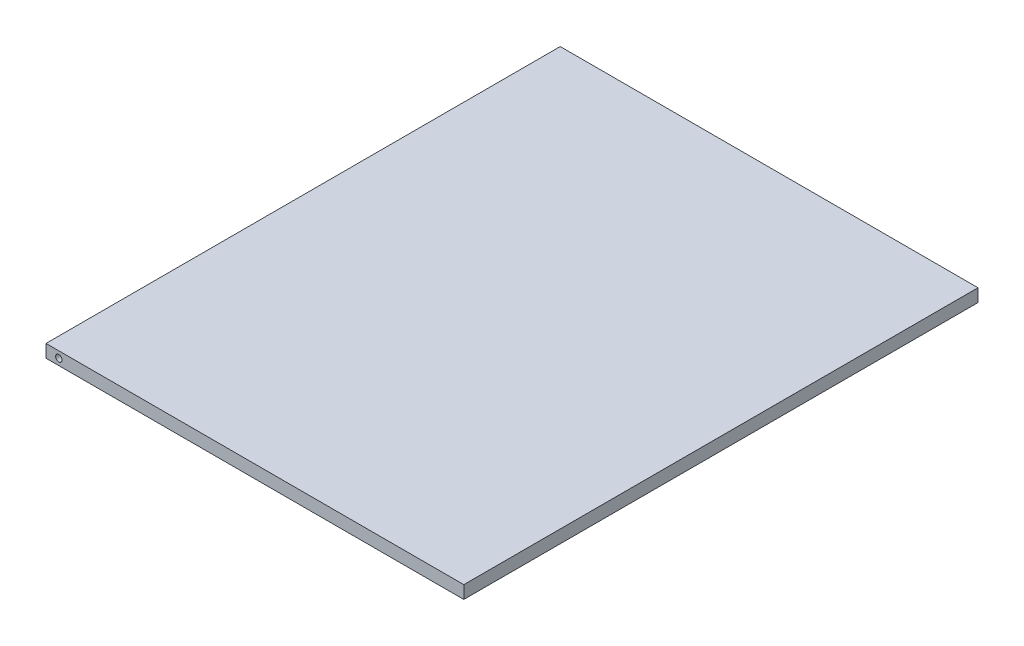
ISO-10303-21;
HEADER;
FILE_DESCRIPTION(('STEP AP214'),'2;1');
FILE_NAME('part.step','',(''),(''),'','','');
FILE_SCHEMA(('AUTOMOTIVE_DESIGN { 1 0 10303 214 1 1 1 1 }'));
ENDSEC;
DATA;
#1=APPLICATION_CONTEXT('core data for automotive mechanical design processes');
#2=APPLICATION_PROTOCOL_DEFINITION('international standard','automotive_design',2000,#1);
#3=PRODUCT_CONTEXT('',#1,'mechanical');
#4=PRODUCT('Part','Part','',(#3));
#5=PRODUCT_RELATED_PRODUCT_CATEGORY('part','',(#4));
#6=PRODUCT_DEFINITION_FORMATION('','',#4);
#7=PRODUCT_DEFINITION_CONTEXT('part definition',#1,'design');
#8=PRODUCT_DEFINITION('design','',#6,#7);
#9=PRODUCT_DEFINITION_SHAPE('','',#8);
#10=(LENGTH_UNIT() NAMED_UNIT(*) SI_UNIT(.MILLI.,.METRE.));
#11=(NAMED_UNIT(*) PLANE_ANGLE_UNIT() SI_UNIT($,.RADIAN.));
#12=(NAMED_UNIT(*) SI_UNIT($,.STERADIAN.) SOLID_ANGLE_UNIT());
#13=UNCERTAINTY_MEASURE_WITH_UNIT(LENGTH_MEASURE(1.E-05),#10,'distance_accuracy_value','');
#14=(GEOMETRIC_REPRESENTATION_CONTEXT(3) GLOBAL_UNCERTAINTY_ASSIGNED_CONTEXT((#13)) GLOBAL_UNIT_ASSIGNED_CONTEXT((#10,
#11,#12)) REPRESENTATION_CONTEXT('',''));
#15=CARTESIAN_POINT('',(0.,0.,0.));
#16=DIRECTION('',(0.,0.,1.));
#17=DIRECTION('',(1.,0.,0.));
#18=AXIS2_PLACEMENT_3D('',#15,#16,#17);
#19=CARTESIAN_POINT('',(-32.5,2.,-40.));
#20=DIRECTION('',(1.,0.,0.));
#21=DIRECTION('',(0.,0.,-1.));
#22=AXIS2_PLACEMENT_3D('',#19,#20,#21);
#23=PLANE('',#22);
#24=DIRECTION('',(0.,0.,1.));
#25=VECTOR('',#24,1.);
#26=CARTESIAN_POINT('',(-32.5,0.,-40.));
#27=LINE('',#26,#25);
#28=CARTESIAN_POINT('',(-32.5,0.,-40.));
#29=VERTEX_POINT('',#28);
#30=CARTESIAN_POINT('',(-32.5,0.,40.));
#31=VERTEX_POINT('',#30);
#32=EDGE_CURVE('E98',#29,#31,#27,.T.);
#33=ORIENTED_EDGE('',*,*,#32,.T.);
#34=DIRECTION('',(0.,-1.,0.));
#35=VECTOR('',#34,1.);
#36=CARTESIAN_POINT('',(-32.5,2.,40.));
#37=LINE('',#36,#35);
#38=CARTESIAN_POINT('',(-32.5,2.,40.));
#39=VERTEX_POINT('',#38);
#40=EDGE_CURVE('E11',#39,#31,#37,.T.);
#41=ORIENTED_EDGE('',*,*,#40,.F.);
#42=DIRECTION('',(0.,0.,1.));
#43=VECTOR('',#42,1.);
#44=CARTESIAN_POINT('',(-32.5,2.,-40.));
#45=LINE('',#44,#43);
#46=CARTESIAN_POINT('',(-32.5,2.,-40.));
#47=VERTEX_POINT('',#46);
#48=EDGE_CURVE('E86',#47,#39,#45,.T.);
#49=ORIENTED_EDGE('',*,*,#48,.F.);
#50=DIRECTION('',(0.,-1.,0.));
#51=VECTOR('',#50,1.);
#52=CARTESIAN_POINT('',(-32.5,2.,-40.));
#53=LINE('',#52,#51);
#54=EDGE_CURVE('E94',#47,#29,#53,.T.);
#55=ORIENTED_EDGE('',*,*,#54,.T.);
#56=EDGE_LOOP('',(#33,#41,#49,#55));
#57=FACE_BOUND('',#56,.T.);
#58=ADVANCED_FACE('F35',(#57),#23,.F.);
#59=CARTESIAN_POINT('',(32.5,2.,40.));
#60=DIRECTION('',(0.,0.,-1.));
#61=DIRECTION('',(-1.,0.,0.));
#62=AXIS2_PLACEMENT_3D('',#59,#60,#61);
#63=PLANE('',#62);
#64=CARTESIAN_POINT('',(-30.5,1.,40.));
#65=DIRECTION('',(0.,0.,1.));
#66=DIRECTION('',(1.,0.,0.));
#67=AXIS2_PLACEMENT_3D('',#64,#65,#66);
#68=CIRCLE('',#67,0.499999999999999);
#69=CARTESIAN_POINT('',(-30.,1.,40.));
#70=VERTEX_POINT('',#69);
#71=EDGE_CURVE('E112',#70,#70,#68,.T.);
#72=ORIENTED_EDGE('',*,*,#71,.F.);
#73=EDGE_LOOP('',(#72));
#74=FACE_BOUND('',#73,.T.);
#75=DIRECTION('',(1.,0.,0.));
#76=VECTOR('',#75,1.);
#77=CARTESIAN_POINT('',(32.5,0.,40.));
#78=LINE('',#77,#76);
#79=CARTESIAN_POINT('',(32.5,0.,40.));
#80=VERTEX_POINT('',#79);
#81=EDGE_CURVE('E90',#31,#80,#78,.T.);
#82=ORIENTED_EDGE('',*,*,#81,.T.);
#83=DIRECTION('',(0.,-1.,0.));
#84=VECTOR('',#83,1.);
#85=CARTESIAN_POINT('',(32.5,2.,40.));
#86=LINE('',#85,#84);
#87=CARTESIAN_POINT('',(32.5,2.,40.));
#88=VERTEX_POINT('',#87);
#89=EDGE_CURVE('E43',#88,#80,#86,.T.);
#90=ORIENTED_EDGE('',*,*,#89,.F.);
#91=DIRECTION('',(1.,0.,0.));
#92=VECTOR('',#91,1.);
#93=CARTESIAN_POINT('',(32.5,2.,40.));
#94=LINE('',#93,#92);
#95=EDGE_CURVE('E81',#39,#88,#94,.T.);
#96=ORIENTED_EDGE('',*,*,#95,.F.);
#97=ORIENTED_EDGE('',*,*,#40,.T.);
#98=EDGE_LOOP('',(#82,#90,#96,#97));
#99=FACE_BOUND('',#98,.T.);
#100=ADVANCED_FACE('F89',(#74,#99),#63,.F.);
#101=CARTESIAN_POINT('',(32.5,2.,-40.));
#102=DIRECTION('',(-1.,0.,0.));
#103=DIRECTION('',(0.,0.,1.));
#104=AXIS2_PLACEMENT_3D('',#101,#102,#103);
#105=PLANE('',#104);
#106=DIRECTION('',(0.,0.,-1.));
#107=VECTOR('',#106,1.);
#108=CARTESIAN_POINT('',(32.5,0.,-40.));
#109=LINE('',#108,#107);
#110=CARTESIAN_POINT('',(32.5,0.,-40.));
#111=VERTEX_POINT('',#110);
#112=EDGE_CURVE('E68',#80,#111,#109,.T.);
#113=ORIENTED_EDGE('',*,*,#112,.T.);
#114=DIRECTION('',(0.,-1.,0.));
#115=VECTOR('',#114,1.);
#116=CARTESIAN_POINT('',(32.5,2.,-40.));
#117=LINE('',#116,#115);
#118=CARTESIAN_POINT('',(32.5,2.,-40.));
#119=VERTEX_POINT('',#118);
#120=EDGE_CURVE('E91',#119,#111,#117,.T.);
#121=ORIENTED_EDGE('',*,*,#120,.F.);
#122=DIRECTION('',(0.,0.,-1.));
#123=VECTOR('',#122,1.);
#124=CARTESIAN_POINT('',(32.5,2.,-40.));
#125=LINE('',#124,#123);
#126=EDGE_CURVE('E84',#88,#119,#125,.T.);
#127=ORIENTED_EDGE('',*,*,#126,.F.);
#128=ORIENTED_EDGE('',*,*,#89,.T.);
#129=EDGE_LOOP('',(#113,#121,#127,#128));
#130=FACE_BOUND('',#129,.T.);
#131=ADVANCED_FACE('F92',(#130),#105,.F.);
#132=CARTESIAN_POINT('',(32.5,2.,-40.));
#133=DIRECTION('',(0.,0.,1.));
#134=DIRECTION('',(1.,0.,0.));
#135=AXIS2_PLACEMENT_3D('',#132,#133,#134);
#136=PLANE('',#135);
#137=CARTESIAN_POINT('',(-30.5,1.,-40.));
#138=DIRECTION('',(0.,0.,1.));
#139=DIRECTION('',(1.,0.,0.));
#140=AXIS2_PLACEMENT_3D('',#137,#138,#139);
#141=CIRCLE('',#140,0.499999999999999);
#142=CARTESIAN_POINT('',(-30.,1.,-40.));
#143=VERTEX_POINT('',#142);
#144=EDGE_CURVE('E101',#143,#143,#141,.T.);
#145=ORIENTED_EDGE('',*,*,#144,.T.);
#146=EDGE_LOOP('',(#145));
#147=FACE_BOUND('',#146,.T.);
#148=DIRECTION('',(-1.,0.,0.));
#149=VECTOR('',#148,1.);
#150=CARTESIAN_POINT('',(32.5,0.,-40.));
#151=LINE('',#150,#149);
#152=EDGE_CURVE('E74',#111,#29,#151,.T.);
#153=ORIENTED_EDGE('',*,*,#152,.T.);
#154=ORIENTED_EDGE('',*,*,#54,.F.);
#155=DIRECTION('',(-1.,0.,0.));
#156=VECTOR('',#155,1.);
#157=CARTESIAN_POINT('',(32.5,2.,-40.));
#158=LINE('',#157,#156);
#159=EDGE_CURVE('E51',#119,#47,#158,.T.);
#160=ORIENTED_EDGE('',*,*,#159,.F.);
#161=ORIENTED_EDGE('',*,*,#120,.T.);
#162=EDGE_LOOP('',(#153,#154,#160,#161));
#163=FACE_BOUND('',#162,.T.);
#164=ADVANCED_FACE('F106',(#147,#163),#136,.F.);
#165=CARTESIAN_POINT('',(0.,2.,0.));
#166=DIRECTION('',(0.,-1.,0.));
#167=DIRECTION('',(0.,0.,-1.));
#168=AXIS2_PLACEMENT_3D('',#165,#166,#167);
#169=PLANE('',#168);
#170=ORIENTED_EDGE('',*,*,#48,.T.);
#171=ORIENTED_EDGE('',*,*,#95,.T.);
#172=ORIENTED_EDGE('',*,*,#126,.T.);
#173=ORIENTED_EDGE('',*,*,#159,.T.);
#174=EDGE_LOOP('',(#170,#171,#172,#173));
#175=FACE_BOUND('',#174,.T.);
#176=ADVANCED_FACE('F82',(#175),#169,.F.);
#177=CARTESIAN_POINT('',(0.,0.,0.));
#178=DIRECTION('',(0.,-1.,0.));
#179=DIRECTION('',(0.,0.,-1.));
#180=AXIS2_PLACEMENT_3D('',#177,#178,#179);
#181=PLANE('',#180);
#182=ORIENTED_EDGE('',*,*,#32,.F.);
#183=ORIENTED_EDGE('',*,*,#152,.F.);
#184=ORIENTED_EDGE('',*,*,#112,.F.);
#185=ORIENTED_EDGE('',*,*,#81,.F.);
#186=EDGE_LOOP('',(#182,#183,#184,#185));
#187=FACE_BOUND('',#186,.T.);
#188=ADVANCED_FACE('F109',(#187),#181,.T.);
#189=CARTESIAN_POINT('',(-30.5,1.,-40.));
#190=DIRECTION('',(0.,0.,1.));
#191=DIRECTION('',(1.,0.,0.));
#192=AXIS2_PLACEMENT_3D('',#189,#190,#191);
#193=CYLINDRICAL_SURFACE('',#192,0.499999999999999);
#194=ORIENTED_EDGE('',*,*,#144,.F.);
#195=EDGE_LOOP('',(#194));
#196=FACE_BOUND('',#195,.T.);
#197=ORIENTED_EDGE('',*,*,#71,.T.);
#198=EDGE_LOOP('',(#197));
#199=FACE_BOUND('',#198,.T.);
#200=ADVANCED_FACE('F119',(#196,#199),#193,.F.);
#201=CLOSED_SHELL('',(#58,#100,#131,#164,#176,#188,#200));
#202=MANIFOLD_SOLID_BREP('B2',#201);
#203=ADVANCED_BREP_SHAPE_REPRESENTATION('',(#18,#202),#14);
#204=SHAPE_DEFINITION_REPRESENTATION(#9,#203);
ENDSEC;
END-ISO-10303-21;
